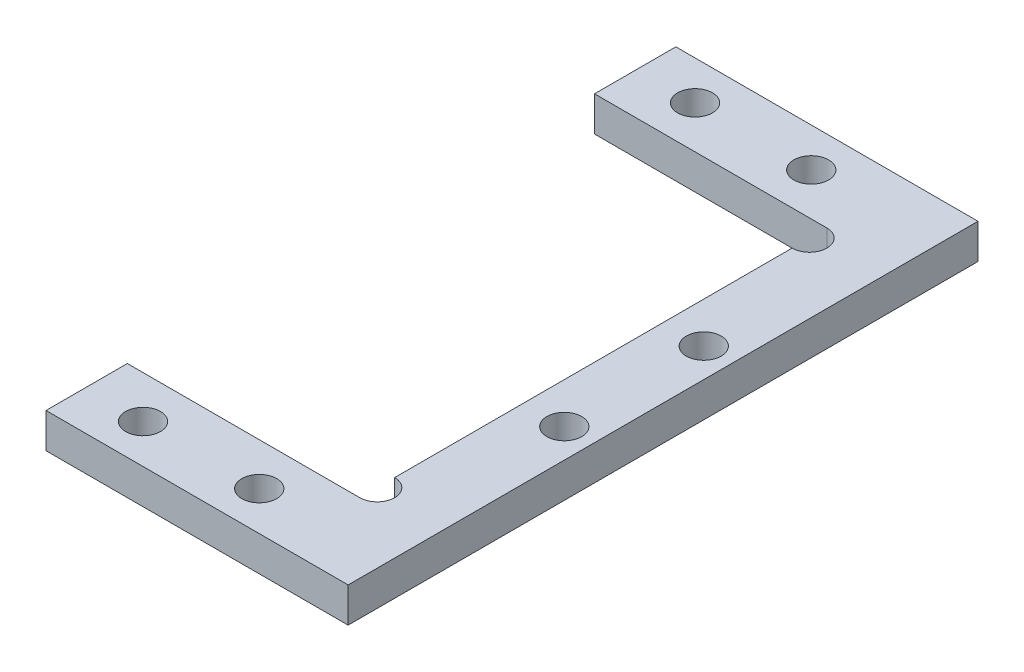
ISO-10303-21;
HEADER;
FILE_DESCRIPTION(('STEP AP214'),'2;1');
FILE_NAME('part.step','',(''),(''),'','','');
FILE_SCHEMA(('AUTOMOTIVE_DESIGN { 1 0 10303 214 1 1 1 1 }'));
ENDSEC;
DATA;
#1=APPLICATION_CONTEXT('core data for automotive mechanical design processes');
#2=APPLICATION_PROTOCOL_DEFINITION('international standard','automotive_design',2000,#1);
#3=PRODUCT_CONTEXT('',#1,'mechanical');
#4=PRODUCT('Part','Part','',(#3));
#5=PRODUCT_RELATED_PRODUCT_CATEGORY('part','',(#4));
#6=PRODUCT_DEFINITION_FORMATION('','',#4);
#7=PRODUCT_DEFINITION_CONTEXT('part definition',#1,'design');
#8=PRODUCT_DEFINITION('design','',#6,#7);
#9=PRODUCT_DEFINITION_SHAPE('','',#8);
#10=(LENGTH_UNIT() NAMED_UNIT(*) SI_UNIT(.MILLI.,.METRE.));
#11=(NAMED_UNIT(*) PLANE_ANGLE_UNIT() SI_UNIT($,.RADIAN.));
#12=(NAMED_UNIT(*) SI_UNIT($,.STERADIAN.) SOLID_ANGLE_UNIT());
#13=UNCERTAINTY_MEASURE_WITH_UNIT(LENGTH_MEASURE(1.E-05),#10,'distance_accuracy_value','');
#14=(GEOMETRIC_REPRESENTATION_CONTEXT(3) GLOBAL_UNCERTAINTY_ASSIGNED_CONTEXT((#13)) GLOBAL_UNIT_ASSIGNED_CONTEXT((#10,
#11,#12)) REPRESENTATION_CONTEXT('',''));
#15=CARTESIAN_POINT('',(0.,0.,0.));
#16=DIRECTION('',(0.,0.,1.));
#17=DIRECTION('',(1.,0.,0.));
#18=AXIS2_PLACEMENT_3D('',#15,#16,#17);
#19=CARTESIAN_POINT('',(0.,3.,7.00000000000001));
#20=DIRECTION('',(0.,0.,-1.));
#21=DIRECTION('',(-1.,0.,0.));
#22=AXIS2_PLACEMENT_3D('',#19,#20,#21);
#23=PLANE('',#22);
#24=DIRECTION('',(1.,0.,0.));
#25=VECTOR('',#24,1.);
#26=CARTESIAN_POINT('',(0.,0.,7.00000000000001));
#27=LINE('',#26,#25);
#28=CARTESIAN_POINT('',(-38.,0.,7.));
#29=VERTEX_POINT('',#28);
#30=CARTESIAN_POINT('',(-12.,0.,7.));
#31=VERTEX_POINT('',#30);
#32=EDGE_CURVE('E79',#29,#31,#27,.T.);
#33=ORIENTED_EDGE('',*,*,#32,.T.);
#34=DIRECTION('',(0.,-1.,0.));
#35=VECTOR('',#34,1.);
#36=CARTESIAN_POINT('',(-12.,3.,7.));
#37=LINE('',#36,#35);
#38=CARTESIAN_POINT('',(-12.,3.,7.));
#39=VERTEX_POINT('',#38);
#40=EDGE_CURVE('E178',#39,#31,#37,.T.);
#41=ORIENTED_EDGE('',*,*,#40,.F.);
#42=DIRECTION('',(1.,0.,0.));
#43=VECTOR('',#42,1.);
#44=CARTESIAN_POINT('',(0.,3.,7.00000000000001));
#45=LINE('',#44,#43);
#46=CARTESIAN_POINT('',(-38.,3.,7.));
#47=VERTEX_POINT('',#46);
#48=EDGE_CURVE('E87',#47,#39,#45,.T.);
#49=ORIENTED_EDGE('',*,*,#48,.F.);
#50=DIRECTION('',(0.,-1.,0.));
#51=VECTOR('',#50,1.);
#52=CARTESIAN_POINT('',(-38.,3.,7.));
#53=LINE('',#52,#51);
#54=EDGE_CURVE('E73',#47,#29,#53,.T.);
#55=ORIENTED_EDGE('',*,*,#54,.T.);
#56=EDGE_LOOP('',(#33,#41,#49,#55));
#57=FACE_BOUND('',#56,.T.);
#58=ADVANCED_FACE('F34',(#57),#23,.F.);
#59=CARTESIAN_POINT('',(0.,3.,0.));
#60=DIRECTION('',(0.,-1.,0.));
#61=DIRECTION('',(0.,0.,-1.));
#62=AXIS2_PLACEMENT_3D('',#59,#60,#61);
#63=PLANE('',#62);
#64=CARTESIAN_POINT('',(-14.5,3.,-14.1));
#65=DIRECTION('',(0.,1.,0.));
#66=DIRECTION('',(0.,0.,1.));
#67=AXIS2_PLACEMENT_3D('',#64,#65,#66);
#68=CIRCLE('',#67,1.5);
#69=CARTESIAN_POINT('',(-14.5,3.,-12.6));
#70=VERTEX_POINT('',#69);
#71=EDGE_CURVE('E187',#70,#70,#68,.T.);
#72=ORIENTED_EDGE('',*,*,#71,.F.);
#73=EDGE_LOOP('',(#72));
#74=FACE_BOUND('',#73,.T.);
#75=CARTESIAN_POINT('',(-14.5,3.,-26.1));
#76=DIRECTION('',(0.,1.,0.));
#77=DIRECTION('',(0.,0.,1.));
#78=AXIS2_PLACEMENT_3D('',#75,#76,#77);
#79=CIRCLE('',#78,1.5);
#80=CARTESIAN_POINT('',(-14.5,3.,-24.6));
#81=VERTEX_POINT('',#80);
#82=EDGE_CURVE('E181',#81,#81,#79,.T.);
#83=ORIENTED_EDGE('',*,*,#82,.F.);
#84=EDGE_LOOP('',(#83));
#85=FACE_BOUND('',#84,.T.);
#86=CARTESIAN_POINT('',(-33.,3.,-43.85));
#87=DIRECTION('',(0.,-1.,0.));
#88=DIRECTION('',(0.,0.,-1.));
#89=AXIS2_PLACEMENT_3D('',#86,#87,#88);
#90=CIRCLE('',#89,1.5);
#91=CARTESIAN_POINT('',(-33.,3.,-45.35));
#92=VERTEX_POINT('',#91);
#93=EDGE_CURVE('E159',#92,#92,#90,.T.);
#94=ORIENTED_EDGE('',*,*,#93,.T.);
#95=EDGE_LOOP('',(#94));
#96=FACE_BOUND('',#95,.T.);
#97=CARTESIAN_POINT('',(-23.,3.,-43.85));
#98=DIRECTION('',(0.,-1.,0.));
#99=DIRECTION('',(0.,0.,-1.));
#100=AXIS2_PLACEMENT_3D('',#97,#98,#99);
#101=CIRCLE('',#100,1.5);
#102=CARTESIAN_POINT('',(-23.,3.,-45.35));
#103=VERTEX_POINT('',#102);
#104=EDGE_CURVE('E152',#103,#103,#101,.T.);
#105=ORIENTED_EDGE('',*,*,#104,.T.);
#106=EDGE_LOOP('',(#105));
#107=FACE_BOUND('',#106,.T.);
#108=CARTESIAN_POINT('',(-33.,3.,3.65));
#109=DIRECTION('',(0.,1.,0.));
#110=DIRECTION('',(0.,0.,1.));
#111=AXIS2_PLACEMENT_3D('',#108,#109,#110);
#112=CIRCLE('',#111,1.5);
#113=CARTESIAN_POINT('',(-33.,3.,5.15000000000001));
#114=VERTEX_POINT('',#113);
#115=EDGE_CURVE('E109',#114,#114,#112,.T.);
#116=ORIENTED_EDGE('',*,*,#115,.F.);
#117=EDGE_LOOP('',(#116));
#118=FACE_BOUND('',#117,.T.);
#119=CARTESIAN_POINT('',(-23.,3.,3.65));
#120=DIRECTION('',(0.,1.,0.));
#121=DIRECTION('',(0.,0.,1.));
#122=AXIS2_PLACEMENT_3D('',#119,#120,#121);
#123=CIRCLE('',#122,1.5);
#124=CARTESIAN_POINT('',(-23.,3.,5.15));
#125=VERTEX_POINT('',#124);
#126=EDGE_CURVE('E102',#125,#125,#123,.T.);
#127=ORIENTED_EDGE('',*,*,#126,.F.);
#128=EDGE_LOOP('',(#127));
#129=FACE_BOUND('',#128,.T.);
#130=ORIENTED_EDGE('',*,*,#48,.T.);
#131=DIRECTION('',(0.,0.,1.));
#132=VECTOR('',#131,1.);
#133=CARTESIAN_POINT('',(-12.,3.,7.));
#134=LINE('',#133,#132);
#135=CARTESIAN_POINT('',(-12.,3.,-47.2));
#136=VERTEX_POINT('',#135);
#137=EDGE_CURVE('E169',#136,#39,#134,.T.);
#138=ORIENTED_EDGE('',*,*,#137,.F.);
#139=DIRECTION('',(1.,0.,0.));
#140=VECTOR('',#139,1.);
#141=CARTESIAN_POINT('',(0.,3.,-47.2));
#142=LINE('',#141,#140);
#143=CARTESIAN_POINT('',(-38.,3.,-47.2));
#144=VERTEX_POINT('',#143);
#145=EDGE_CURVE('E138',#144,#136,#142,.T.);
#146=ORIENTED_EDGE('',*,*,#145,.F.);
#147=DIRECTION('',(0.,0.,-1.));
#148=VECTOR('',#147,1.);
#149=CARTESIAN_POINT('',(-38.,3.,-40.2));
#150=LINE('',#149,#148);
#151=CARTESIAN_POINT('',(-38.,3.,-40.2));
#152=VERTEX_POINT('',#151);
#153=EDGE_CURVE('E147',#152,#144,#150,.T.);
#154=ORIENTED_EDGE('',*,*,#153,.F.);
#155=DIRECTION('',(-1.,0.,0.));
#156=VECTOR('',#155,1.);
#157=CARTESIAN_POINT('',(0.,3.,-40.2));
#158=LINE('',#157,#156);
#159=CARTESIAN_POINT('',(-18.,3.,-40.2));
#160=VERTEX_POINT('',#159);
#161=EDGE_CURVE('E134',#160,#152,#158,.T.);
#162=ORIENTED_EDGE('',*,*,#161,.F.);
#163=CARTESIAN_POINT('',(-18.,3.,-38.7));
#164=DIRECTION('',(0.,-1.,0.));
#165=DIRECTION('',(0.,0.,-1.));
#166=AXIS2_PLACEMENT_3D('',#163,#164,#165);
#167=CIRCLE('',#166,1.5);
#168=CARTESIAN_POINT('',(-18.,3.,-37.2));
#169=VERTEX_POINT('',#168);
#170=EDGE_CURVE('E167',#160,#169,#167,.T.);
#171=ORIENTED_EDGE('',*,*,#170,.T.);
#172=DIRECTION('',(0.,0.,1.));
#173=VECTOR('',#172,1.);
#174=CARTESIAN_POINT('',(-18.,3.,0.));
#175=LINE('',#174,#173);
#176=CARTESIAN_POINT('',(-18.,3.,-3.));
#177=VERTEX_POINT('',#176);
#178=EDGE_CURVE('E49',#169,#177,#175,.T.);
#179=ORIENTED_EDGE('',*,*,#178,.T.);
#180=CARTESIAN_POINT('',(-18.,3.,-1.5));
#181=DIRECTION('',(0.,1.,0.));
#182=DIRECTION('',(0.,0.,1.));
#183=AXIS2_PLACEMENT_3D('',#180,#181,#182);
#184=CIRCLE('',#183,1.5);
#185=CARTESIAN_POINT('',(-18.,3.,0.));
#186=VERTEX_POINT('',#185);
#187=EDGE_CURVE('E124',#186,#177,#184,.T.);
#188=ORIENTED_EDGE('',*,*,#187,.F.);
#189=DIRECTION('',(-1.,0.,0.));
#190=VECTOR('',#189,1.);
#191=CARTESIAN_POINT('',(0.,3.,0.));
#192=LINE('',#191,#190);
#193=CARTESIAN_POINT('',(-38.,3.,0.));
#194=VERTEX_POINT('',#193);
#195=EDGE_CURVE('E94',#186,#194,#192,.T.);
#196=ORIENTED_EDGE('',*,*,#195,.T.);
#197=DIRECTION('',(0.,0.,1.));
#198=VECTOR('',#197,1.);
#199=CARTESIAN_POINT('',(-38.,3.,0.));
#200=LINE('',#199,#198);
#201=EDGE_CURVE('E57',#194,#47,#200,.T.);
#202=ORIENTED_EDGE('',*,*,#201,.T.);
#203=EDGE_LOOP('',(#130,#138,#146,#154,#162,#171,#179,#188,#196,#202));
#204=FACE_BOUND('',#203,.T.);
#205=ADVANCED_FACE('F202',(#74,#85,#96,#107,#118,#129,#204),#63,.F.);
#206=CARTESIAN_POINT('',(0.,0.,0.));
#207=DIRECTION('',(0.,-1.,0.));
#208=DIRECTION('',(0.,0.,-1.));
#209=AXIS2_PLACEMENT_3D('',#206,#207,#208);
#210=PLANE('',#209);
#211=CARTESIAN_POINT('',(-14.5,0.,-14.1));
#212=DIRECTION('',(0.,1.,0.));
#213=DIRECTION('',(0.,0.,1.));
#214=AXIS2_PLACEMENT_3D('',#211,#212,#213);
#215=CIRCLE('',#214,1.5);
#216=CARTESIAN_POINT('',(-14.5,0.,-12.6));
#217=VERTEX_POINT('',#216);
#218=EDGE_CURVE('E180',#217,#217,#215,.T.);
#219=ORIENTED_EDGE('',*,*,#218,.T.);
#220=EDGE_LOOP('',(#219));
#221=FACE_BOUND('',#220,.T.);
#222=CARTESIAN_POINT('',(-14.5,0.,-26.1));
#223=DIRECTION('',(0.,1.,0.));
#224=DIRECTION('',(0.,0.,1.));
#225=AXIS2_PLACEMENT_3D('',#222,#223,#224);
#226=CIRCLE('',#225,1.5);
#227=CARTESIAN_POINT('',(-14.5,0.,-24.6));
#228=VERTEX_POINT('',#227);
#229=EDGE_CURVE('E184',#228,#228,#226,.T.);
#230=ORIENTED_EDGE('',*,*,#229,.T.);
#231=EDGE_LOOP('',(#230));
#232=FACE_BOUND('',#231,.T.);
#233=CARTESIAN_POINT('',(-23.,0.,3.65));
#234=DIRECTION('',(0.,1.,0.));
#235=DIRECTION('',(0.,0.,1.));
#236=AXIS2_PLACEMENT_3D('',#233,#234,#235);
#237=CIRCLE('',#236,1.5);
#238=CARTESIAN_POINT('',(-23.,0.,5.15));
#239=VERTEX_POINT('',#238);
#240=EDGE_CURVE('E105',#239,#239,#237,.T.);
#241=ORIENTED_EDGE('',*,*,#240,.T.);
#242=EDGE_LOOP('',(#241));
#243=FACE_BOUND('',#242,.T.);
#244=CARTESIAN_POINT('',(-33.,0.,3.65));
#245=DIRECTION('',(0.,1.,0.));
#246=DIRECTION('',(0.,0.,1.));
#247=AXIS2_PLACEMENT_3D('',#244,#245,#246);
#248=CIRCLE('',#247,1.5);
#249=CARTESIAN_POINT('',(-33.,0.,5.15000000000001));
#250=VERTEX_POINT('',#249);
#251=EDGE_CURVE('E99',#250,#250,#248,.T.);
#252=ORIENTED_EDGE('',*,*,#251,.T.);
#253=EDGE_LOOP('',(#252));
#254=FACE_BOUND('',#253,.T.);
#255=CARTESIAN_POINT('',(-23.,0.,-43.85));
#256=DIRECTION('',(0.,-1.,0.));
#257=DIRECTION('',(0.,0.,-1.));
#258=AXIS2_PLACEMENT_3D('',#255,#256,#257);
#259=CIRCLE('',#258,1.5);
#260=CARTESIAN_POINT('',(-23.,0.,-45.35));
#261=VERTEX_POINT('',#260);
#262=EDGE_CURVE('E155',#261,#261,#259,.T.);
#263=ORIENTED_EDGE('',*,*,#262,.F.);
#264=EDGE_LOOP('',(#263));
#265=FACE_BOUND('',#264,.T.);
#266=CARTESIAN_POINT('',(-33.,0.,-43.85));
#267=DIRECTION('',(0.,-1.,0.));
#268=DIRECTION('',(0.,0.,-1.));
#269=AXIS2_PLACEMENT_3D('',#266,#267,#268);
#270=CIRCLE('',#269,1.5);
#271=CARTESIAN_POINT('',(-33.,0.,-45.35));
#272=VERTEX_POINT('',#271);
#273=EDGE_CURVE('E144',#272,#272,#270,.T.);
#274=ORIENTED_EDGE('',*,*,#273,.F.);
#275=EDGE_LOOP('',(#274));
#276=FACE_BOUND('',#275,.T.);
#277=DIRECTION('',(1.,0.,0.));
#278=VECTOR('',#277,1.);
#279=CARTESIAN_POINT('',(0.,0.,-47.2));
#280=LINE('',#279,#278);
#281=CARTESIAN_POINT('',(-38.,0.,-47.2));
#282=VERTEX_POINT('',#281);
#283=CARTESIAN_POINT('',(-12.,0.,-47.2));
#284=VERTEX_POINT('',#283);
#285=EDGE_CURVE('E142',#282,#284,#280,.T.);
#286=ORIENTED_EDGE('',*,*,#285,.T.);
#287=DIRECTION('',(0.,0.,-1.));
#288=VECTOR('',#287,1.);
#289=CARTESIAN_POINT('',(-12.,0.,7.));
#290=LINE('',#289,#288);
#291=EDGE_CURVE('E92',#31,#284,#290,.T.);
#292=ORIENTED_EDGE('',*,*,#291,.F.);
#293=ORIENTED_EDGE('',*,*,#32,.F.);
#294=DIRECTION('',(0.,0.,1.));
#295=VECTOR('',#294,1.);
#296=CARTESIAN_POINT('',(-38.,0.,0.));
#297=LINE('',#296,#295);
#298=CARTESIAN_POINT('',(-38.,0.,0.));
#299=VERTEX_POINT('',#298);
#300=EDGE_CURVE('E70',#299,#29,#297,.T.);
#301=ORIENTED_EDGE('',*,*,#300,.F.);
#302=DIRECTION('',(-1.,0.,0.));
#303=VECTOR('',#302,1.);
#304=CARTESIAN_POINT('',(0.,0.,0.));
#305=LINE('',#304,#303);
#306=CARTESIAN_POINT('',(-18.,0.,0.));
#307=VERTEX_POINT('',#306);
#308=EDGE_CURVE('E80',#307,#299,#305,.T.);
#309=ORIENTED_EDGE('',*,*,#308,.F.);
#310=CARTESIAN_POINT('',(-18.,0.,-1.5));
#311=DIRECTION('',(0.,1.,0.));
#312=DIRECTION('',(0.,0.,1.));
#313=AXIS2_PLACEMENT_3D('',#310,#311,#312);
#314=CIRCLE('',#313,1.5);
#315=CARTESIAN_POINT('',(-18.,0.,-3.));
#316=VERTEX_POINT('',#315);
#317=EDGE_CURVE('E121',#307,#316,#314,.T.);
#318=ORIENTED_EDGE('',*,*,#317,.T.);
#319=DIRECTION('',(0.,0.,1.));
#320=VECTOR('',#319,1.);
#321=CARTESIAN_POINT('',(-18.,0.,0.));
#322=LINE('',#321,#320);
#323=CARTESIAN_POINT('',(-18.,0.,-37.2));
#324=VERTEX_POINT('',#323);
#325=EDGE_CURVE('E117',#324,#316,#322,.T.);
#326=ORIENTED_EDGE('',*,*,#325,.F.);
#327=CARTESIAN_POINT('',(-18.,0.,-38.7));
#328=DIRECTION('',(0.,-1.,0.));
#329=DIRECTION('',(0.,0.,-1.));
#330=AXIS2_PLACEMENT_3D('',#327,#328,#329);
#331=CIRCLE('',#330,1.5);
#332=CARTESIAN_POINT('',(-18.,0.,-40.2));
#333=VERTEX_POINT('',#332);
#334=EDGE_CURVE('E166',#333,#324,#331,.T.);
#335=ORIENTED_EDGE('',*,*,#334,.F.);
#336=DIRECTION('',(-1.,0.,0.));
#337=VECTOR('',#336,1.);
#338=CARTESIAN_POINT('',(0.,0.,-40.2));
#339=LINE('',#338,#337);
#340=CARTESIAN_POINT('',(-38.,0.,-40.2));
#341=VERTEX_POINT('',#340);
#342=EDGE_CURVE('E135',#333,#341,#339,.T.);
#343=ORIENTED_EDGE('',*,*,#342,.T.);
#344=DIRECTION('',(0.,0.,-1.));
#345=VECTOR('',#344,1.);
#346=CARTESIAN_POINT('',(-38.,0.,-40.2));
#347=LINE('',#346,#345);
#348=EDGE_CURVE('E139',#341,#282,#347,.T.);
#349=ORIENTED_EDGE('',*,*,#348,.T.);
#350=EDGE_LOOP('',(#286,#292,#293,#301,#309,#318,#326,#335,#343,#349));
#351=FACE_BOUND('',#350,.T.);
#352=ADVANCED_FACE('F90',(#221,#232,#243,#254,#265,#276,#351),#210,.T.);
#353=CARTESIAN_POINT('',(0.,3.,-47.2));
#354=DIRECTION('',(0.,0.,-1.));
#355=DIRECTION('',(-1.,0.,0.));
#356=AXIS2_PLACEMENT_3D('',#353,#354,#355);
#357=PLANE('',#356);
#358=ORIENTED_EDGE('',*,*,#145,.T.);
#359=DIRECTION('',(0.,1.,0.));
#360=VECTOR('',#359,1.);
#361=CARTESIAN_POINT('',(-12.,3.,-47.2));
#362=LINE('',#361,#360);
#363=EDGE_CURVE('E174',#284,#136,#362,.T.);
#364=ORIENTED_EDGE('',*,*,#363,.F.);
#365=ORIENTED_EDGE('',*,*,#285,.F.);
#366=DIRECTION('',(0.,-1.,0.));
#367=VECTOR('',#366,1.);
#368=CARTESIAN_POINT('',(-38.,3.,-47.2));
#369=LINE('',#368,#367);
#370=EDGE_CURVE('E126',#144,#282,#369,.T.);
#371=ORIENTED_EDGE('',*,*,#370,.F.);
#372=EDGE_LOOP('',(#358,#364,#365,#371));
#373=FACE_BOUND('',#372,.T.);
#374=ADVANCED_FACE('F228',(#373),#357,.T.);
#375=CARTESIAN_POINT('',(-18.,0.,0.));
#376=DIRECTION('',(-1.,0.,0.));
#377=DIRECTION('',(0.,0.,1.));
#378=AXIS2_PLACEMENT_3D('',#375,#376,#377);
#379=PLANE('',#378);
#380=ORIENTED_EDGE('',*,*,#178,.F.);
#381=DIRECTION('',(0.,1.,0.));
#382=VECTOR('',#381,1.);
#383=CARTESIAN_POINT('',(-18.,0.,-37.2));
#384=LINE('',#383,#382);
#385=EDGE_CURVE('E156',#169,#324,#384,.F.);
#386=ORIENTED_EDGE('',*,*,#385,.T.);
#387=ORIENTED_EDGE('',*,*,#325,.T.);
#388=DIRECTION('',(0.,1.,0.));
#389=VECTOR('',#388,1.);
#390=CARTESIAN_POINT('',(-18.,0.,-3.));
#391=LINE('',#390,#389);
#392=EDGE_CURVE('E11',#177,#316,#391,.F.);
#393=ORIENTED_EDGE('',*,*,#392,.F.);
#394=EDGE_LOOP('',(#380,#386,#387,#393));
#395=FACE_BOUND('',#394,.T.);
#396=ADVANCED_FACE('F258',(#395),#379,.T.);
#397=CARTESIAN_POINT('',(0.,3.,0.));
#398=DIRECTION('',(0.,0.,1.));
#399=DIRECTION('',(1.,0.,0.));
#400=AXIS2_PLACEMENT_3D('',#397,#398,#399);
#401=PLANE('',#400);
#402=DIRECTION('',(0.,1.,0.));
#403=VECTOR('',#402,1.);
#404=CARTESIAN_POINT('',(-18.,0.,0.));
#405=LINE('',#404,#403);
#406=EDGE_CURVE('E114',#307,#186,#405,.T.);
#407=ORIENTED_EDGE('',*,*,#406,.F.);
#408=ORIENTED_EDGE('',*,*,#308,.T.);
#409=DIRECTION('',(0.,-1.,0.));
#410=VECTOR('',#409,1.);
#411=CARTESIAN_POINT('',(-38.,3.,0.));
#412=LINE('',#411,#410);
#413=EDGE_CURVE('E42',#194,#299,#412,.T.);
#414=ORIENTED_EDGE('',*,*,#413,.F.);
#415=ORIENTED_EDGE('',*,*,#195,.F.);
#416=EDGE_LOOP('',(#407,#408,#414,#415));
#417=FACE_BOUND('',#416,.T.);
#418=ADVANCED_FACE('F36',(#417),#401,.F.);
#419=CARTESIAN_POINT('',(-38.,3.,0.));
#420=DIRECTION('',(1.,0.,0.));
#421=DIRECTION('',(0.,0.,-1.));
#422=AXIS2_PLACEMENT_3D('',#419,#420,#421);
#423=PLANE('',#422);
#424=ORIENTED_EDGE('',*,*,#300,.T.);
#425=ORIENTED_EDGE('',*,*,#54,.F.);
#426=ORIENTED_EDGE('',*,*,#201,.F.);
#427=ORIENTED_EDGE('',*,*,#413,.T.);
#428=EDGE_LOOP('',(#424,#425,#426,#427));
#429=FACE_BOUND('',#428,.T.);
#430=ADVANCED_FACE('F72',(#429),#423,.F.);
#431=CARTESIAN_POINT('',(-23.,0.,3.65));
#432=DIRECTION('',(0.,1.,0.));
#433=DIRECTION('',(0.,0.,1.));
#434=AXIS2_PLACEMENT_3D('',#431,#432,#433);
#435=CYLINDRICAL_SURFACE('',#434,1.5);
#436=ORIENTED_EDGE('',*,*,#240,.F.);
#437=EDGE_LOOP('',(#436));
#438=FACE_BOUND('',#437,.T.);
#439=ORIENTED_EDGE('',*,*,#126,.T.);
#440=EDGE_LOOP('',(#439));
#441=FACE_BOUND('',#440,.T.);
#442=ADVANCED_FACE('F270',(#438,#441),#435,.F.);
#443=CARTESIAN_POINT('',(-33.,0.,3.65));
#444=DIRECTION('',(0.,1.,0.));
#445=DIRECTION('',(0.,0.,1.));
#446=AXIS2_PLACEMENT_3D('',#443,#444,#445);
#447=CYLINDRICAL_SURFACE('',#446,1.5);
#448=ORIENTED_EDGE('',*,*,#251,.F.);
#449=EDGE_LOOP('',(#448));
#450=FACE_BOUND('',#449,.T.);
#451=ORIENTED_EDGE('',*,*,#115,.T.);
#452=EDGE_LOOP('',(#451));
#453=FACE_BOUND('',#452,.T.);
#454=ADVANCED_FACE('F281',(#450,#453),#447,.F.);
#455=CARTESIAN_POINT('',(-18.,0.,-1.5));
#456=DIRECTION('',(0.,1.,0.));
#457=DIRECTION('',(0.,0.,1.));
#458=AXIS2_PLACEMENT_3D('',#455,#456,#457);
#459=CYLINDRICAL_SURFACE('',#458,1.5);
#460=ORIENTED_EDGE('',*,*,#406,.T.);
#461=ORIENTED_EDGE('',*,*,#187,.T.);
#462=ORIENTED_EDGE('',*,*,#392,.T.);
#463=ORIENTED_EDGE('',*,*,#317,.F.);
#464=EDGE_LOOP('',(#460,#461,#462,#463));
#465=FACE_BOUND('',#464,.T.);
#466=ADVANCED_FACE('F261',(#465),#459,.F.);
#467=CARTESIAN_POINT('',(-38.,3.,-40.2));
#468=DIRECTION('',(-1.,0.,0.));
#469=DIRECTION('',(0.,0.,1.));
#470=AXIS2_PLACEMENT_3D('',#467,#468,#469);
#471=PLANE('',#470);
#472=ORIENTED_EDGE('',*,*,#348,.F.);
#473=DIRECTION('',(0.,-1.,0.));
#474=VECTOR('',#473,1.);
#475=CARTESIAN_POINT('',(-38.,3.,-40.2));
#476=LINE('',#475,#474);
#477=EDGE_CURVE('E131',#152,#341,#476,.T.);
#478=ORIENTED_EDGE('',*,*,#477,.F.);
#479=ORIENTED_EDGE('',*,*,#153,.T.);
#480=ORIENTED_EDGE('',*,*,#370,.T.);
#481=EDGE_LOOP('',(#472,#478,#479,#480));
#482=FACE_BOUND('',#481,.T.);
#483=ADVANCED_FACE('F288',(#482),#471,.T.);
#484=CARTESIAN_POINT('',(0.,3.,-40.2));
#485=DIRECTION('',(0.,0.,1.));
#486=DIRECTION('',(1.,0.,0.));
#487=AXIS2_PLACEMENT_3D('',#484,#485,#486);
#488=PLANE('',#487);
#489=ORIENTED_EDGE('',*,*,#342,.F.);
#490=DIRECTION('',(0.,1.,0.));
#491=VECTOR('',#490,1.);
#492=CARTESIAN_POINT('',(-18.,0.,-40.2));
#493=LINE('',#492,#491);
#494=EDGE_CURVE('E106',#333,#160,#493,.T.);
#495=ORIENTED_EDGE('',*,*,#494,.T.);
#496=ORIENTED_EDGE('',*,*,#161,.T.);
#497=ORIENTED_EDGE('',*,*,#477,.T.);
#498=EDGE_LOOP('',(#489,#495,#496,#497));
#499=FACE_BOUND('',#498,.T.);
#500=ADVANCED_FACE('F293',(#499),#488,.T.);
#501=CARTESIAN_POINT('',(-23.,0.,-43.85));
#502=DIRECTION('',(0.,1.,0.));
#503=DIRECTION('',(0.,0.,1.));
#504=AXIS2_PLACEMENT_3D('',#501,#502,#503);
#505=CYLINDRICAL_SURFACE('',#504,1.5);
#506=ORIENTED_EDGE('',*,*,#262,.T.);
#507=EDGE_LOOP('',(#506));
#508=FACE_BOUND('',#507,.T.);
#509=ORIENTED_EDGE('',*,*,#104,.F.);
#510=EDGE_LOOP('',(#509));
#511=FACE_BOUND('',#510,.T.);
#512=ADVANCED_FACE('F297',(#508,#511),#505,.F.);
#513=CARTESIAN_POINT('',(-33.,0.,-43.85));
#514=DIRECTION('',(0.,1.,0.));
#515=DIRECTION('',(0.,0.,1.));
#516=AXIS2_PLACEMENT_3D('',#513,#514,#515);
#517=CYLINDRICAL_SURFACE('',#516,1.5);
#518=ORIENTED_EDGE('',*,*,#273,.T.);
#519=EDGE_LOOP('',(#518));
#520=FACE_BOUND('',#519,.T.);
#521=ORIENTED_EDGE('',*,*,#93,.F.);
#522=EDGE_LOOP('',(#521));
#523=FACE_BOUND('',#522,.T.);
#524=ADVANCED_FACE('F301',(#520,#523),#517,.F.);
#525=CARTESIAN_POINT('',(-18.,0.,-38.7));
#526=DIRECTION('',(0.,1.,0.));
#527=DIRECTION('',(0.,0.,1.));
#528=AXIS2_PLACEMENT_3D('',#525,#526,#527);
#529=CYLINDRICAL_SURFACE('',#528,1.5);
#530=ORIENTED_EDGE('',*,*,#170,.F.);
#531=ORIENTED_EDGE('',*,*,#494,.F.);
#532=ORIENTED_EDGE('',*,*,#334,.T.);
#533=ORIENTED_EDGE('',*,*,#385,.F.);
#534=EDGE_LOOP('',(#530,#531,#532,#533));
#535=FACE_BOUND('',#534,.T.);
#536=ADVANCED_FACE('F305',(#535),#529,.F.);
#537=CARTESIAN_POINT('',(-12.,0.,0.));
#538=DIRECTION('',(1.,0.,0.));
#539=DIRECTION('',(0.,0.,-1.));
#540=AXIS2_PLACEMENT_3D('',#537,#538,#539);
#541=PLANE('',#540);
#542=ORIENTED_EDGE('',*,*,#40,.T.);
#543=ORIENTED_EDGE('',*,*,#291,.T.);
#544=ORIENTED_EDGE('',*,*,#363,.T.);
#545=ORIENTED_EDGE('',*,*,#137,.T.);
#546=EDGE_LOOP('',(#542,#543,#544,#545));
#547=FACE_BOUND('',#546,.T.);
#548=ADVANCED_FACE('F222',(#547),#541,.T.);
#549=CARTESIAN_POINT('',(-14.5,0.,-26.1));
#550=DIRECTION('',(0.,1.,0.));
#551=DIRECTION('',(0.,0.,1.));
#552=AXIS2_PLACEMENT_3D('',#549,#550,#551);
#553=CYLINDRICAL_SURFACE('',#552,1.5);
#554=ORIENTED_EDGE('',*,*,#229,.F.);
#555=EDGE_LOOP('',(#554));
#556=FACE_BOUND('',#555,.T.);
#557=ORIENTED_EDGE('',*,*,#82,.T.);
#558=EDGE_LOOP('',(#557));
#559=FACE_BOUND('',#558,.T.);
#560=ADVANCED_FACE('F198',(#556,#559),#553,.F.);
#561=CARTESIAN_POINT('',(-14.5,0.,-14.1));
#562=DIRECTION('',(0.,1.,0.));
#563=DIRECTION('',(0.,0.,1.));
#564=AXIS2_PLACEMENT_3D('',#561,#562,#563);
#565=CYLINDRICAL_SURFACE('',#564,1.5);
#566=ORIENTED_EDGE('',*,*,#218,.F.);
#567=EDGE_LOOP('',(#566));
#568=FACE_BOUND('',#567,.T.);
#569=ORIENTED_EDGE('',*,*,#71,.T.);
#570=EDGE_LOOP('',(#569));
#571=FACE_BOUND('',#570,.T.);
#572=ADVANCED_FACE('F195',(#568,#571),#565,.F.);
#573=CLOSED_SHELL('',(#58,#205,#352,#374,#396,#418,#430,#442,#454,#466,#483,#500,#512,#524,#536,
#548,#560,#572));
#574=MANIFOLD_SOLID_BREP('B2',#573);
#575=ADVANCED_BREP_SHAPE_REPRESENTATION('',(#18,#574),#14);
#576=SHAPE_DEFINITION_REPRESENTATION(#9,#575);
ENDSEC;
END-ISO-10303-21;
